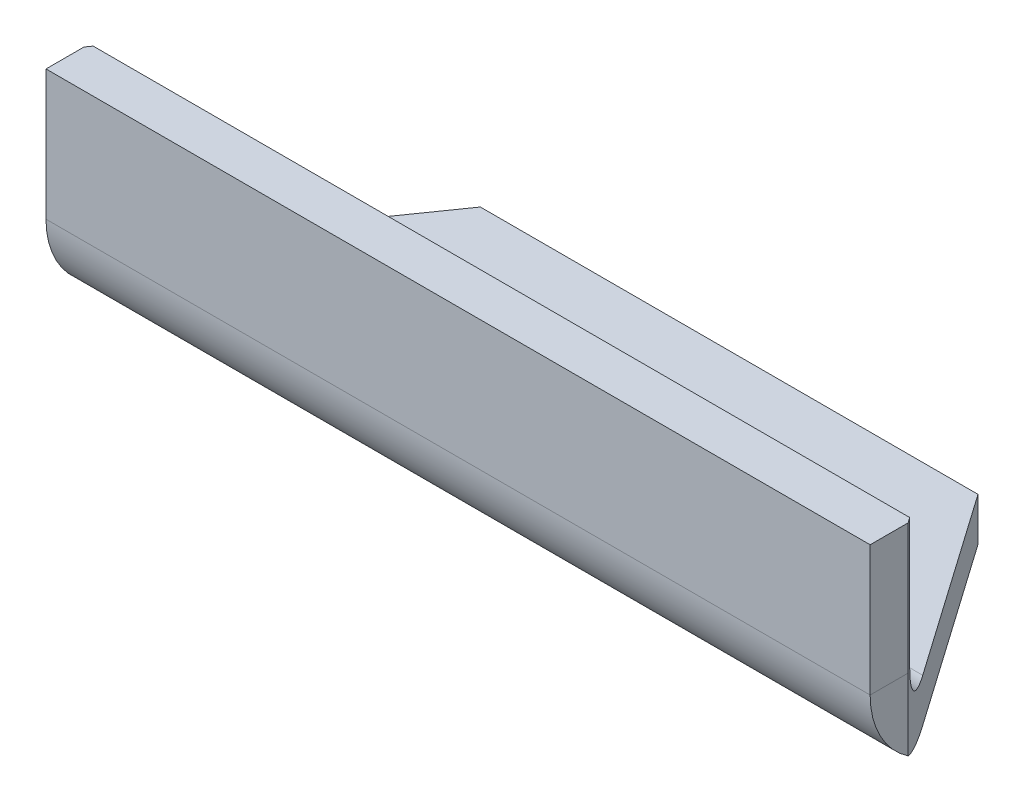
ISO-10303-21;
HEADER;
FILE_DESCRIPTION(('STEP AP214'),'2;1');
FILE_NAME('part.step','',(''),(''),'','','');
FILE_SCHEMA(('AUTOMOTIVE_DESIGN { 1 0 10303 214 1 1 1 1 }'));
ENDSEC;
DATA;
#1=APPLICATION_CONTEXT('core data for automotive mechanical design processes');
#2=APPLICATION_PROTOCOL_DEFINITION('international standard','automotive_design',2000,#1);
#3=PRODUCT_CONTEXT('',#1,'mechanical');
#4=PRODUCT('Part','Part','',(#3));
#5=PRODUCT_RELATED_PRODUCT_CATEGORY('part','',(#4));
#6=PRODUCT_DEFINITION_FORMATION('','',#4);
#7=PRODUCT_DEFINITION_CONTEXT('part definition',#1,'design');
#8=PRODUCT_DEFINITION('design','',#6,#7);
#9=PRODUCT_DEFINITION_SHAPE('','',#8);
#10=(LENGTH_UNIT() NAMED_UNIT(*) SI_UNIT(.MILLI.,.METRE.));
#11=(NAMED_UNIT(*) PLANE_ANGLE_UNIT() SI_UNIT($,.RADIAN.));
#12=(NAMED_UNIT(*) SI_UNIT($,.STERADIAN.) SOLID_ANGLE_UNIT());
#13=UNCERTAINTY_MEASURE_WITH_UNIT(LENGTH_MEASURE(1.E-05),#10,'distance_accuracy_value','');
#14=(GEOMETRIC_REPRESENTATION_CONTEXT(3) GLOBAL_UNCERTAINTY_ASSIGNED_CONTEXT((#13)) GLOBAL_UNIT_ASSIGNED_CONTEXT((#10,
#11,#12)) REPRESENTATION_CONTEXT('',''));
#15=CARTESIAN_POINT('',(0.,0.,0.));
#16=DIRECTION('',(0.,0.,1.));
#17=DIRECTION('',(1.,0.,0.));
#18=AXIS2_PLACEMENT_3D('',#15,#16,#17);
#19=CARTESIAN_POINT('',(0.,-8.,0.));
#20=DIRECTION('',(0.,-1.,0.));
#21=DIRECTION('',(0.,0.,-1.));
#22=AXIS2_PLACEMENT_3D('',#19,#20,#21);
#23=PLANE('',#22);
#24=DIRECTION('',(-1.,0.,0.));
#25=VECTOR('',#24,1.);
#26=CARTESIAN_POINT('',(-76.,-8.,-25.));
#27=LINE('',#26,#25);
#28=CARTESIAN_POINT('',(45.891075856982,-8.,-25.));
#29=VERTEX_POINT('',#28);
#30=CARTESIAN_POINT('',(-45.891075856982,-8.,-25.));
#31=VERTEX_POINT('',#30);
#32=EDGE_CURVE('E168',#29,#31,#27,.T.);
#33=ORIENTED_EDGE('',*,*,#32,.F.);
#34=DIRECTION('',(0.573576436351051,0.,0.819152044288988));
#35=VECTOR('',#34,1.);
#36=CARTESIAN_POINT('',(42.5395318593017,-8.,-29.7865008797955));
#37=LINE('',#36,#35);
#38=CARTESIAN_POINT('',(69.6981321561124,-8.00000000000003,9.00000000000002));
#39=VERTEX_POINT('',#38);
#40=EDGE_CURVE('E196',#39,#29,#37,.F.);
#41=ORIENTED_EDGE('',*,*,#40,.F.);
#42=DIRECTION('',(1.,0.,0.));
#43=VECTOR('',#42,1.);
#44=CARTESIAN_POINT('',(76.,-8.00000000000003,9.00000000000002));
#45=LINE('',#44,#43);
#46=CARTESIAN_POINT('',(-69.6981321561124,-8.00000000000003,9.00000000000002));
#47=VERTEX_POINT('',#46);
#48=EDGE_CURVE('E81',#39,#47,#45,.F.);
#49=ORIENTED_EDGE('',*,*,#48,.T.);
#50=DIRECTION('',(-0.573576436351051,0.,0.819152044288988));
#51=VECTOR('',#50,1.);
#52=CARTESIAN_POINT('',(-42.5395318593017,-8.,-29.7865008797955));
#53=LINE('',#52,#51);
#54=EDGE_CURVE('E13',#47,#31,#53,.F.);
#55=ORIENTED_EDGE('',*,*,#54,.T.);
#56=EDGE_LOOP('',(#33,#41,#49,#55));
#57=FACE_BOUND('',#56,.T.);
#58=ADVANCED_FACE('F58',(#57),#23,.T.);
#59=CARTESIAN_POINT('',(0.,0.,0.));
#60=DIRECTION('',(0.,-1.,0.));
#61=DIRECTION('',(0.,0.,-1.));
#62=AXIS2_PLACEMENT_3D('',#59,#60,#61);
#63=PLANE('',#62);
#64=DIRECTION('',(-0.573576436351051,0.,-0.819152044288988));
#65=VECTOR('',#64,1.);
#66=CARTESIAN_POINT('',(45.891075856982,0.,-25.));
#67=LINE('',#66,#65);
#68=CARTESIAN_POINT('',(45.891075856982,0.,-25.));
#69=VERTEX_POINT('',#68);
#70=CARTESIAN_POINT('',(69.6981321561124,0.,9.00000000000002));
#71=VERTEX_POINT('',#70);
#72=EDGE_CURVE('E203',#69,#71,#67,.F.);
#73=ORIENTED_EDGE('',*,*,#72,.F.);
#74=DIRECTION('',(-1.,0.,0.));
#75=VECTOR('',#74,1.);
#76=CARTESIAN_POINT('',(-76.,0.,-25.));
#77=LINE('',#76,#75);
#78=CARTESIAN_POINT('',(-45.891075856982,0.,-25.));
#79=VERTEX_POINT('',#78);
#80=EDGE_CURVE('E171',#69,#79,#77,.T.);
#81=ORIENTED_EDGE('',*,*,#80,.T.);
#82=DIRECTION('',(0.573576436351051,0.,-0.819152044288988));
#83=VECTOR('',#82,1.);
#84=CARTESIAN_POINT('',(-45.891075856982,0.,-25.));
#85=LINE('',#84,#83);
#86=CARTESIAN_POINT('',(-69.6981321561124,0.,9.00000000000002));
#87=VERTEX_POINT('',#86);
#88=EDGE_CURVE('E175',#79,#87,#85,.F.);
#89=ORIENTED_EDGE('',*,*,#88,.T.);
#90=DIRECTION('',(1.,0.,0.));
#91=VECTOR('',#90,1.);
#92=CARTESIAN_POINT('',(76.,0.,9.00000000000002));
#93=LINE('',#92,#91);
#94=EDGE_CURVE('E160',#71,#87,#93,.F.);
#95=ORIENTED_EDGE('',*,*,#94,.F.);
#96=EDGE_LOOP('',(#73,#81,#89,#95));
#97=FACE_BOUND('',#96,.T.);
#98=ADVANCED_FACE('F261',(#97),#63,.F.);
#99=CARTESIAN_POINT('',(-76.,-8.,-25.));
#100=DIRECTION('',(0.,0.,-1.));
#101=DIRECTION('',(-1.,0.,0.));
#102=AXIS2_PLACEMENT_3D('',#99,#100,#101);
#103=PLANE('',#102);
#104=ORIENTED_EDGE('',*,*,#80,.F.);
#105=DIRECTION('',(0.,1.,0.));
#106=VECTOR('',#105,1.);
#107=CARTESIAN_POINT('',(45.891075856982,-8.,-25.));
#108=LINE('',#107,#106);
#109=EDGE_CURVE('E201',#29,#69,#108,.T.);
#110=ORIENTED_EDGE('',*,*,#109,.F.);
#111=ORIENTED_EDGE('',*,*,#32,.T.);
#112=DIRECTION('',(0.,1.,0.));
#113=VECTOR('',#112,1.);
#114=CARTESIAN_POINT('',(-45.891075856982,-8.,-25.));
#115=LINE('',#114,#113);
#116=EDGE_CURVE('E170',#31,#79,#115,.T.);
#117=ORIENTED_EDGE('',*,*,#116,.T.);
#118=EDGE_LOOP('',(#104,#110,#111,#117));
#119=FACE_BOUND('',#118,.T.);
#120=ADVANCED_FACE('F200',(#119),#103,.T.);
#121=CARTESIAN_POINT('',(76.,7.99999999999997,9.00000000000002));
#122=DIRECTION('',(-1.,0.,0.));
#123=DIRECTION('',(0.,0.,1.));
#124=AXIS2_PLACEMENT_3D('',#121,#122,#123);
#125=PLANE('',#124);
#126=CARTESIAN_POINT('',(76.,7.99999999999997,9.00000000000002));
#127=DIRECTION('',(1.,0.,0.));
#128=DIRECTION('',(0.,0.,-1.));
#129=AXIS2_PLACEMENT_3D('',#126,#127,#128);
#130=CIRCLE('',#129,16.);
#131=CARTESIAN_POINT('',(76.,7.99999999999997,25.));
#132=VERTEX_POINT('',#131);
#133=CARTESIAN_POINT('',(76.,-5.22875655532285,18.0000000000002));
#134=VERTEX_POINT('',#133);
#135=EDGE_CURVE('E155',#132,#134,#130,.T.);
#136=ORIENTED_EDGE('',*,*,#135,.T.);
#137=DIRECTION('',(0.,-1.,0.));
#138=VECTOR('',#137,1.);
#139=CARTESIAN_POINT('',(76.,7.99999999999997,18.0000000000002));
#140=LINE('',#139,#138);
#141=CARTESIAN_POINT('',(76.,7.99999999999997,18.0000000000002));
#142=VERTEX_POINT('',#141);
#143=EDGE_CURVE('E141',#142,#134,#140,.T.);
#144=ORIENTED_EDGE('',*,*,#143,.F.);
#145=DIRECTION('',(0.,0.,-1.));
#146=VECTOR('',#145,1.);
#147=CARTESIAN_POINT('',(76.,7.99999999999997,17.));
#148=LINE('',#147,#146);
#149=EDGE_CURVE('E159',#142,#132,#148,.F.);
#150=ORIENTED_EDGE('',*,*,#149,.T.);
#151=EDGE_LOOP('',(#136,#144,#150));
#152=FACE_BOUND('',#151,.T.);
#153=ADVANCED_FACE('F158',(#152),#125,.F.);
#154=CARTESIAN_POINT('',(76.,7.99999999999997,9.00000000000002));
#155=DIRECTION('',(1.,0.,0.));
#156=DIRECTION('',(0.,0.,1.));
#157=AXIS2_PLACEMENT_3D('',#154,#155,#156);
#158=CYLINDRICAL_SURFACE('',#157,16.);
#159=ORIENTED_EDGE('',*,*,#48,.F.);
#160=CARTESIAN_POINT('',(69.6981321561124,7.99999999999997,9.00000000000002));
#161=DIRECTION('',(0.819152044288988,0.,-0.573576436351051));
#162=DIRECTION('',(-0.573576436351051,0.,-0.819152044288988));
#163=AXIS2_PLACEMENT_3D('',#160,#161,#162);
#164=ELLIPSE('',#163,19.5323934201834,16.);
#165=EDGE_CURVE('E144',#134,#39,#164,.T.);
#166=ORIENTED_EDGE('',*,*,#165,.F.);
#167=ORIENTED_EDGE('',*,*,#135,.F.);
#168=DIRECTION('',(1.,0.,0.));
#169=VECTOR('',#168,1.);
#170=CARTESIAN_POINT('',(-76.,7.99999999999997,25.));
#171=LINE('',#170,#169);
#172=CARTESIAN_POINT('',(-76.,7.99999999999997,25.));
#173=VERTEX_POINT('',#172);
#174=EDGE_CURVE('E225',#132,#173,#171,.F.);
#175=ORIENTED_EDGE('',*,*,#174,.T.);
#176=CARTESIAN_POINT('',(-76.,7.99999999999997,9.00000000000002));
#177=DIRECTION('',(1.,0.,0.));
#178=DIRECTION('',(0.,0.,-1.));
#179=AXIS2_PLACEMENT_3D('',#176,#177,#178);
#180=CIRCLE('',#179,16.);
#181=CARTESIAN_POINT('',(-76.,-5.22875655532285,18.0000000000002));
#182=VERTEX_POINT('',#181);
#183=EDGE_CURVE('E162',#182,#173,#180,.F.);
#184=ORIENTED_EDGE('',*,*,#183,.F.);
#185=CARTESIAN_POINT('',(-69.6981321561124,7.99999999999997,9.00000000000002));
#186=DIRECTION('',(0.819152044288988,0.,0.573576436351051));
#187=DIRECTION('',(0.573576436351051,0.,-0.819152044288988));
#188=AXIS2_PLACEMENT_3D('',#185,#186,#187);
#189=ELLIPSE('',#188,19.5323934201834,16.);
#190=EDGE_CURVE('E67',#182,#47,#189,.T.);
#191=ORIENTED_EDGE('',*,*,#190,.T.);
#192=EDGE_LOOP('',(#159,#166,#167,#175,#184,#191));
#193=FACE_BOUND('',#192,.T.);
#194=ADVANCED_FACE('F153',(#193),#158,.T.);
#195=CARTESIAN_POINT('',(76.,7.99999999999997,9.00000000000002));
#196=DIRECTION('',(1.,0.,0.));
#197=DIRECTION('',(0.,0.,1.));
#198=AXIS2_PLACEMENT_3D('',#195,#196,#197);
#199=CYLINDRICAL_SURFACE('',#198,8.);
#200=CARTESIAN_POINT('',(69.6981321561124,7.99999999999997,9.00000000000002));
#201=DIRECTION('',(0.819152044288988,0.,-0.573576436351051));
#202=DIRECTION('',(-0.573576436351051,0.,-0.819152044288988));
#203=AXIS2_PLACEMENT_3D('',#200,#201,#202);
#204=ELLIPSE('',#203,9.76619671009169,8.);
#205=CARTESIAN_POINT('',(75.2997924617902,7.99999999999997,17.));
#206=VERTEX_POINT('',#205);
#207=EDGE_CURVE('E207',#71,#206,#204,.F.);
#208=ORIENTED_EDGE('',*,*,#207,.F.);
#209=ORIENTED_EDGE('',*,*,#94,.T.);
#210=CARTESIAN_POINT('',(-69.6981321561124,7.99999999999997,9.00000000000002));
#211=DIRECTION('',(0.819152044288988,0.,0.573576436351051));
#212=DIRECTION('',(0.573576436351051,0.,-0.819152044288988));
#213=AXIS2_PLACEMENT_3D('',#210,#211,#212);
#214=ELLIPSE('',#213,9.76619671009169,8.);
#215=CARTESIAN_POINT('',(-75.2997924617902,7.99999999999997,17.));
#216=VERTEX_POINT('',#215);
#217=EDGE_CURVE('E178',#87,#216,#214,.F.);
#218=ORIENTED_EDGE('',*,*,#217,.T.);
#219=DIRECTION('',(1.,0.,0.));
#220=VECTOR('',#219,1.);
#221=CARTESIAN_POINT('',(-76.,7.99999999999997,17.));
#222=LINE('',#221,#220);
#223=EDGE_CURVE('E228',#216,#206,#222,.T.);
#224=ORIENTED_EDGE('',*,*,#223,.T.);
#225=EDGE_LOOP('',(#208,#209,#218,#224));
#226=FACE_BOUND('',#225,.T.);
#227=ADVANCED_FACE('F275',(#226),#199,.F.);
#228=CARTESIAN_POINT('',(76.,32.,25.));
#229=DIRECTION('',(-1.,0.,0.));
#230=DIRECTION('',(0.,-1.,0.));
#231=AXIS2_PLACEMENT_3D('',#228,#229,#230);
#232=PLANE('',#231);
#233=CARTESIAN_POINT('',(76.,32.,18.0000000000001));
#234=VERTEX_POINT('',#233);
#235=EDGE_CURVE('E146',#234,#142,#140,.T.);
#236=ORIENTED_EDGE('',*,*,#235,.F.);
#237=DIRECTION('',(0.,0.,-1.));
#238=VECTOR('',#237,1.);
#239=CARTESIAN_POINT('',(76.,32.,25.));
#240=LINE('',#239,#238);
#241=CARTESIAN_POINT('',(76.,32.,25.));
#242=VERTEX_POINT('',#241);
#243=EDGE_CURVE('E164',#242,#234,#240,.T.);
#244=ORIENTED_EDGE('',*,*,#243,.F.);
#245=DIRECTION('',(0.,1.,0.));
#246=VECTOR('',#245,1.);
#247=CARTESIAN_POINT('',(76.,-1.31838984174237E-13,25.));
#248=LINE('',#247,#246);
#249=EDGE_CURVE('E218',#132,#242,#248,.T.);
#250=ORIENTED_EDGE('',*,*,#249,.F.);
#251=ORIENTED_EDGE('',*,*,#149,.F.);
#252=EDGE_LOOP('',(#236,#244,#250,#251));
#253=FACE_BOUND('',#252,.T.);
#254=ADVANCED_FACE('F280',(#253),#232,.F.);
#255=CARTESIAN_POINT('',(0.,0.,17.));
#256=DIRECTION('',(0.,0.,-1.));
#257=DIRECTION('',(-1.,0.,0.));
#258=AXIS2_PLACEMENT_3D('',#255,#256,#257);
#259=PLANE('',#258);
#260=DIRECTION('',(1.,0.,0.));
#261=VECTOR('',#260,1.);
#262=CARTESIAN_POINT('',(-76.,32.,17.));
#263=LINE('',#262,#261);
#264=CARTESIAN_POINT('',(75.2997924617901,32.,17.));
#265=VERTEX_POINT('',#264);
#266=CARTESIAN_POINT('',(-75.2997924617902,32.,17.));
#267=VERTEX_POINT('',#266);
#268=EDGE_CURVE('E223',#265,#267,#263,.F.);
#269=ORIENTED_EDGE('',*,*,#268,.F.);
#270=DIRECTION('',(0.,-1.,0.));
#271=VECTOR('',#270,1.);
#272=CARTESIAN_POINT('',(75.2997924617901,0.,17.));
#273=LINE('',#272,#271);
#274=EDGE_CURVE('E74',#206,#265,#273,.F.);
#275=ORIENTED_EDGE('',*,*,#274,.F.);
#276=ORIENTED_EDGE('',*,*,#223,.F.);
#277=DIRECTION('',(0.,-1.,0.));
#278=VECTOR('',#277,1.);
#279=CARTESIAN_POINT('',(-75.2997924617901,0.,17.));
#280=LINE('',#279,#278);
#281=EDGE_CURVE('E180',#216,#267,#280,.F.);
#282=ORIENTED_EDGE('',*,*,#281,.T.);
#283=EDGE_LOOP('',(#269,#275,#276,#282));
#284=FACE_BOUND('',#283,.T.);
#285=ADVANCED_FACE('F256',(#284),#259,.T.);
#286=CARTESIAN_POINT('',(-76.,32.,25.));
#287=DIRECTION('',(0.,-1.,0.));
#288=DIRECTION('',(0.,0.,-1.));
#289=AXIS2_PLACEMENT_3D('',#286,#287,#288);
#290=PLANE('',#289);
#291=DIRECTION('',(-0.573576436351051,0.,-0.819152044288988));
#292=VECTOR('',#291,1.);
#293=CARTESIAN_POINT('',(45.891075856982,32.,-25.));
#294=LINE('',#293,#292);
#295=EDGE_CURVE('E393',#265,#234,#294,.F.);
#296=ORIENTED_EDGE('',*,*,#295,.F.);
#297=ORIENTED_EDGE('',*,*,#268,.T.);
#298=DIRECTION('',(0.573576436351051,0.,-0.819152044288988));
#299=VECTOR('',#298,1.);
#300=CARTESIAN_POINT('',(-45.891075856982,32.,-25.));
#301=LINE('',#300,#299);
#302=CARTESIAN_POINT('',(-76.,32.,18.0000000000001));
#303=VERTEX_POINT('',#302);
#304=EDGE_CURVE('E183',#267,#303,#301,.F.);
#305=ORIENTED_EDGE('',*,*,#304,.T.);
#306=DIRECTION('',(0.,0.,-1.));
#307=VECTOR('',#306,1.);
#308=CARTESIAN_POINT('',(-76.,32.,25.));
#309=LINE('',#308,#307);
#310=CARTESIAN_POINT('',(-76.,32.,25.));
#311=VERTEX_POINT('',#310);
#312=EDGE_CURVE('E213',#311,#303,#309,.T.);
#313=ORIENTED_EDGE('',*,*,#312,.F.);
#314=DIRECTION('',(-1.,0.,0.));
#315=VECTOR('',#314,1.);
#316=CARTESIAN_POINT('',(0.,32.,25.));
#317=LINE('',#316,#315);
#318=EDGE_CURVE('E216',#242,#311,#317,.T.);
#319=ORIENTED_EDGE('',*,*,#318,.F.);
#320=ORIENTED_EDGE('',*,*,#243,.T.);
#321=EDGE_LOOP('',(#296,#297,#305,#313,#319,#320));
#322=FACE_BOUND('',#321,.T.);
#323=ADVANCED_FACE('F245',(#322),#290,.F.);
#324=CARTESIAN_POINT('',(-76.,7.99999999999997,9.00000000000002));
#325=DIRECTION('',(-1.,0.,0.));
#326=DIRECTION('',(0.,0.,1.));
#327=AXIS2_PLACEMENT_3D('',#324,#325,#326);
#328=PLANE('',#327);
#329=DIRECTION('',(0.,0.,-1.));
#330=VECTOR('',#329,1.);
#331=CARTESIAN_POINT('',(-76.,7.99999999999997,25.));
#332=LINE('',#331,#330);
#333=CARTESIAN_POINT('',(-76.,7.99999999999997,18.0000000000002));
#334=VERTEX_POINT('',#333);
#335=EDGE_CURVE('E205',#334,#173,#332,.F.);
#336=ORIENTED_EDGE('',*,*,#335,.F.);
#337=DIRECTION('',(0.,-1.,0.));
#338=VECTOR('',#337,1.);
#339=CARTESIAN_POINT('',(-76.,7.99999999999997,18.0000000000002));
#340=LINE('',#339,#338);
#341=EDGE_CURVE('E187',#334,#182,#340,.T.);
#342=ORIENTED_EDGE('',*,*,#341,.T.);
#343=ORIENTED_EDGE('',*,*,#183,.T.);
#344=EDGE_LOOP('',(#336,#342,#343));
#345=FACE_BOUND('',#344,.T.);
#346=ADVANCED_FACE('F248',(#345),#328,.T.);
#347=CARTESIAN_POINT('',(-76.,0.,25.));
#348=DIRECTION('',(1.,0.,0.));
#349=DIRECTION('',(0.,1.,0.));
#350=AXIS2_PLACEMENT_3D('',#347,#348,#349);
#351=PLANE('',#350);
#352=ORIENTED_EDGE('',*,*,#312,.T.);
#353=DIRECTION('',(0.,1.,0.));
#354=VECTOR('',#353,1.);
#355=CARTESIAN_POINT('',(-76.,-7.99999999999988,18.0000000000002));
#356=LINE('',#355,#354);
#357=EDGE_CURVE('E185',#303,#334,#356,.F.);
#358=ORIENTED_EDGE('',*,*,#357,.T.);
#359=ORIENTED_EDGE('',*,*,#335,.T.);
#360=DIRECTION('',(0.,-1.,0.));
#361=VECTOR('',#360,1.);
#362=CARTESIAN_POINT('',(-76.,0.,25.));
#363=LINE('',#362,#361);
#364=EDGE_CURVE('E220',#311,#173,#363,.T.);
#365=ORIENTED_EDGE('',*,*,#364,.F.);
#366=EDGE_LOOP('',(#352,#358,#359,#365));
#367=FACE_BOUND('',#366,.T.);
#368=ADVANCED_FACE('F235',(#367),#351,.F.);
#369=CARTESIAN_POINT('',(0.,0.,25.));
#370=DIRECTION('',(0.,0.,-1.));
#371=DIRECTION('',(-1.,0.,0.));
#372=AXIS2_PLACEMENT_3D('',#369,#370,#371);
#373=PLANE('',#372);
#374=ORIENTED_EDGE('',*,*,#174,.F.);
#375=ORIENTED_EDGE('',*,*,#249,.T.);
#376=ORIENTED_EDGE('',*,*,#318,.T.);
#377=ORIENTED_EDGE('',*,*,#364,.T.);
#378=EDGE_LOOP('',(#374,#375,#376,#377));
#379=FACE_BOUND('',#378,.T.);
#380=ADVANCED_FACE('F240',(#379),#373,.F.);
#381=CARTESIAN_POINT('',(-45.891075856982,-8.,-25.));
#382=DIRECTION('',(0.819152044288988,0.,0.573576436351051));
#383=DIRECTION('',(0.,1.,0.));
#384=AXIS2_PLACEMENT_3D('',#381,#382,#383);
#385=PLANE('',#384);
#386=ORIENTED_EDGE('',*,*,#190,.F.);
#387=ORIENTED_EDGE('',*,*,#341,.F.);
#388=ORIENTED_EDGE('',*,*,#357,.F.);
#389=ORIENTED_EDGE('',*,*,#304,.F.);
#390=ORIENTED_EDGE('',*,*,#281,.F.);
#391=ORIENTED_EDGE('',*,*,#217,.F.);
#392=ORIENTED_EDGE('',*,*,#88,.F.);
#393=ORIENTED_EDGE('',*,*,#116,.F.);
#394=ORIENTED_EDGE('',*,*,#54,.F.);
#395=EDGE_LOOP('',(#386,#387,#388,#389,#390,#391,#392,#393,#394));
#396=FACE_BOUND('',#395,.T.);
#397=ADVANCED_FACE('F61',(#396),#385,.F.);
#398=CARTESIAN_POINT('',(45.891075856982,-8.,-25.));
#399=DIRECTION('',(-0.819152044288988,0.,0.573576436351051));
#400=DIRECTION('',(0.,1.,0.));
#401=AXIS2_PLACEMENT_3D('',#398,#399,#400);
#402=PLANE('',#401);
#403=ORIENTED_EDGE('',*,*,#165,.T.);
#404=ORIENTED_EDGE('',*,*,#40,.T.);
#405=ORIENTED_EDGE('',*,*,#109,.T.);
#406=ORIENTED_EDGE('',*,*,#72,.T.);
#407=ORIENTED_EDGE('',*,*,#207,.T.);
#408=ORIENTED_EDGE('',*,*,#274,.T.);
#409=ORIENTED_EDGE('',*,*,#295,.T.);
#410=ORIENTED_EDGE('',*,*,#235,.T.);
#411=ORIENTED_EDGE('',*,*,#143,.T.);
#412=EDGE_LOOP('',(#403,#404,#405,#406,#407,#408,#409,#410,#411));
#413=FACE_BOUND('',#412,.T.);
#414=ADVANCED_FACE('F143',(#413),#402,.F.);
#415=CLOSED_SHELL('',(#58,#98,#120,#153,#194,#227,#254,#285,#323,#346,#368,#380,#397,#414));
#416=MANIFOLD_SOLID_BREP('B2',#415);
#417=ADVANCED_BREP_SHAPE_REPRESENTATION('',(#18,#416),#14);
#418=SHAPE_DEFINITION_REPRESENTATION(#9,#417);
ENDSEC;
END-ISO-10303-21;
